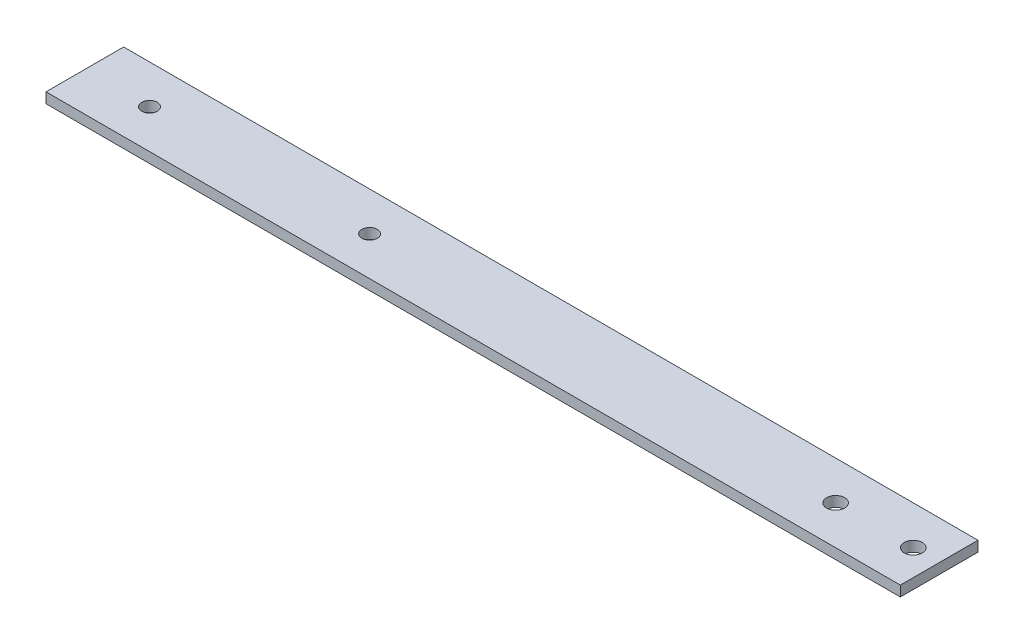
ISO-10303-21;
HEADER;
FILE_DESCRIPTION(('STEP AP214'),'2;1');
FILE_NAME('part.step','',(''),(''),'','','');
FILE_SCHEMA(('AUTOMOTIVE_DESIGN { 1 0 10303 214 1 1 1 1 }'));
ENDSEC;
DATA;
#1=APPLICATION_CONTEXT('core data for automotive mechanical design processes');
#2=APPLICATION_PROTOCOL_DEFINITION('international standard','automotive_design',2000,#1);
#3=PRODUCT_CONTEXT('',#1,'mechanical');
#4=PRODUCT('Part','Part','',(#3));
#5=PRODUCT_RELATED_PRODUCT_CATEGORY('part','',(#4));
#6=PRODUCT_DEFINITION_FORMATION('','',#4);
#7=PRODUCT_DEFINITION_CONTEXT('part definition',#1,'design');
#8=PRODUCT_DEFINITION('design','',#6,#7);
#9=PRODUCT_DEFINITION_SHAPE('','',#8);
#10=(LENGTH_UNIT() NAMED_UNIT(*) SI_UNIT(.MILLI.,.METRE.));
#11=(NAMED_UNIT(*) PLANE_ANGLE_UNIT() SI_UNIT($,.RADIAN.));
#12=(NAMED_UNIT(*) SI_UNIT($,.STERADIAN.) SOLID_ANGLE_UNIT());
#13=UNCERTAINTY_MEASURE_WITH_UNIT(LENGTH_MEASURE(1.E-05),#10,'distance_accuracy_value','');
#14=(GEOMETRIC_REPRESENTATION_CONTEXT(3) GLOBAL_UNCERTAINTY_ASSIGNED_CONTEXT((#13)) GLOBAL_UNIT_ASSIGNED_CONTEXT((#10,
#11,#12)) REPRESENTATION_CONTEXT('',''));
#15=CARTESIAN_POINT('',(0.,0.,0.));
#16=DIRECTION('',(0.,0.,1.));
#17=DIRECTION('',(1.,0.,0.));
#18=AXIS2_PLACEMENT_3D('',#15,#16,#17);
#19=CARTESIAN_POINT('',(165.,-4.,15.));
#20=DIRECTION('',(1.,0.,0.));
#21=DIRECTION('',(0.,0.,-1.));
#22=AXIS2_PLACEMENT_3D('',#19,#20,#21);
#23=PLANE('',#22);
#24=DIRECTION('',(0.,0.,-1.));
#25=VECTOR('',#24,1.);
#26=CARTESIAN_POINT('',(165.,0.,15.));
#27=LINE('',#26,#25);
#28=CARTESIAN_POINT('',(165.,0.,15.));
#29=VERTEX_POINT('',#28);
#30=CARTESIAN_POINT('',(165.,0.,-15.));
#31=VERTEX_POINT('',#30);
#32=EDGE_CURVE('E82',#29,#31,#27,.T.);
#33=ORIENTED_EDGE('',*,*,#32,.F.);
#34=DIRECTION('',(0.,1.,0.));
#35=VECTOR('',#34,1.);
#36=CARTESIAN_POINT('',(165.,-4.,15.));
#37=LINE('',#36,#35);
#38=CARTESIAN_POINT('',(165.,-4.,15.));
#39=VERTEX_POINT('',#38);
#40=EDGE_CURVE('E11',#39,#29,#37,.T.);
#41=ORIENTED_EDGE('',*,*,#40,.F.);
#42=DIRECTION('',(0.,0.,-1.));
#43=VECTOR('',#42,1.);
#44=CARTESIAN_POINT('',(165.,-4.,15.));
#45=LINE('',#44,#43);
#46=CARTESIAN_POINT('',(165.,-4.,-15.));
#47=VERTEX_POINT('',#46);
#48=EDGE_CURVE('E75',#39,#47,#45,.T.);
#49=ORIENTED_EDGE('',*,*,#48,.T.);
#50=DIRECTION('',(0.,1.,0.));
#51=VECTOR('',#50,1.);
#52=CARTESIAN_POINT('',(165.,-4.,-15.));
#53=LINE('',#52,#51);
#54=EDGE_CURVE('E20',#47,#31,#53,.T.);
#55=ORIENTED_EDGE('',*,*,#54,.T.);
#56=EDGE_LOOP('',(#33,#41,#49,#55));
#57=FACE_BOUND('',#56,.T.);
#58=ADVANCED_FACE('F17',(#57),#23,.T.);
#59=CARTESIAN_POINT('',(-165.,-4.,15.));
#60=DIRECTION('',(0.,0.,1.));
#61=DIRECTION('',(1.,0.,0.));
#62=AXIS2_PLACEMENT_3D('',#59,#60,#61);
#63=PLANE('',#62);
#64=DIRECTION('',(1.,0.,0.));
#65=VECTOR('',#64,1.);
#66=CARTESIAN_POINT('',(-165.,0.,15.));
#67=LINE('',#66,#65);
#68=CARTESIAN_POINT('',(-165.,0.,15.));
#69=VERTEX_POINT('',#68);
#70=EDGE_CURVE('E77',#69,#29,#67,.T.);
#71=ORIENTED_EDGE('',*,*,#70,.F.);
#72=DIRECTION('',(0.,1.,0.));
#73=VECTOR('',#72,1.);
#74=CARTESIAN_POINT('',(-165.,-4.,15.));
#75=LINE('',#74,#73);
#76=CARTESIAN_POINT('',(-165.,-4.,15.));
#77=VERTEX_POINT('',#76);
#78=EDGE_CURVE('E26',#77,#69,#75,.T.);
#79=ORIENTED_EDGE('',*,*,#78,.F.);
#80=DIRECTION('',(1.,0.,0.));
#81=VECTOR('',#80,1.);
#82=CARTESIAN_POINT('',(-165.,-4.,15.));
#83=LINE('',#82,#81);
#84=EDGE_CURVE('E72',#77,#39,#83,.T.);
#85=ORIENTED_EDGE('',*,*,#84,.T.);
#86=ORIENTED_EDGE('',*,*,#40,.T.);
#87=EDGE_LOOP('',(#71,#79,#85,#86));
#88=FACE_BOUND('',#87,.T.);
#89=ADVANCED_FACE('F93',(#88),#63,.T.);
#90=CARTESIAN_POINT('',(-165.,-4.,15.));
#91=DIRECTION('',(-1.,0.,0.));
#92=DIRECTION('',(0.,0.,1.));
#93=AXIS2_PLACEMENT_3D('',#90,#91,#92);
#94=PLANE('',#93);
#95=DIRECTION('',(0.,0.,1.));
#96=VECTOR('',#95,1.);
#97=CARTESIAN_POINT('',(-165.,0.,15.));
#98=LINE('',#97,#96);
#99=CARTESIAN_POINT('',(-165.,0.,-15.));
#100=VERTEX_POINT('',#99);
#101=EDGE_CURVE('E67',#100,#69,#98,.T.);
#102=ORIENTED_EDGE('',*,*,#101,.F.);
#103=DIRECTION('',(0.,1.,0.));
#104=VECTOR('',#103,1.);
#105=CARTESIAN_POINT('',(-165.,-4.,-15.));
#106=LINE('',#105,#104);
#107=CARTESIAN_POINT('',(-165.,-4.,-15.));
#108=VERTEX_POINT('',#107);
#109=EDGE_CURVE('E62',#108,#100,#106,.T.);
#110=ORIENTED_EDGE('',*,*,#109,.F.);
#111=DIRECTION('',(0.,0.,1.));
#112=VECTOR('',#111,1.);
#113=CARTESIAN_POINT('',(-165.,-4.,15.));
#114=LINE('',#113,#112);
#115=EDGE_CURVE('E65',#108,#77,#114,.T.);
#116=ORIENTED_EDGE('',*,*,#115,.T.);
#117=ORIENTED_EDGE('',*,*,#78,.T.);
#118=EDGE_LOOP('',(#102,#110,#116,#117));
#119=FACE_BOUND('',#118,.T.);
#120=ADVANCED_FACE('F64',(#119),#94,.T.);
#121=CARTESIAN_POINT('',(-165.,-4.,-15.));
#122=DIRECTION('',(0.,0.,-1.));
#123=DIRECTION('',(-1.,0.,0.));
#124=AXIS2_PLACEMENT_3D('',#121,#122,#123);
#125=PLANE('',#124);
#126=DIRECTION('',(-1.,0.,0.));
#127=VECTOR('',#126,1.);
#128=CARTESIAN_POINT('',(-165.,0.,-15.));
#129=LINE('',#128,#127);
#130=EDGE_CURVE('E85',#31,#100,#129,.T.);
#131=ORIENTED_EDGE('',*,*,#130,.F.);
#132=ORIENTED_EDGE('',*,*,#54,.F.);
#133=DIRECTION('',(-1.,0.,0.));
#134=VECTOR('',#133,1.);
#135=CARTESIAN_POINT('',(-165.,-4.,-15.));
#136=LINE('',#135,#134);
#137=EDGE_CURVE('E71',#47,#108,#136,.T.);
#138=ORIENTED_EDGE('',*,*,#137,.T.);
#139=ORIENTED_EDGE('',*,*,#109,.T.);
#140=EDGE_LOOP('',(#131,#132,#138,#139));
#141=FACE_BOUND('',#140,.T.);
#142=ADVANCED_FACE('F74',(#141),#125,.T.);
#143=CARTESIAN_POINT('',(0.,-4.,0.));
#144=DIRECTION('',(0.,-1.,0.));
#145=DIRECTION('',(0.,0.,-1.));
#146=AXIS2_PLACEMENT_3D('',#143,#144,#145);
#147=PLANE('',#146);
#148=CARTESIAN_POINT('',(-55.,-4.,0.));
#149=DIRECTION('',(0.,-1.,0.));
#150=DIRECTION('',(0.,0.,-1.));
#151=AXIS2_PLACEMENT_3D('',#148,#149,#150);
#152=CIRCLE('',#151,3.);
#153=CARTESIAN_POINT('',(-55.,-4.,-3.));
#154=VERTEX_POINT('',#153);
#155=EDGE_CURVE('E142',#154,#154,#152,.T.);
#156=ORIENTED_EDGE('',*,*,#155,.F.);
#157=EDGE_LOOP('',(#156));
#158=FACE_BOUND('',#157,.T.);
#159=CARTESIAN_POINT('',(-140.,-4.,0.));
#160=DIRECTION('',(0.,-1.,0.));
#161=DIRECTION('',(0.,0.,-1.));
#162=AXIS2_PLACEMENT_3D('',#159,#160,#161);
#163=CIRCLE('',#162,3.);
#164=CARTESIAN_POINT('',(-140.,-4.,-3.));
#165=VERTEX_POINT('',#164);
#166=EDGE_CURVE('E144',#165,#165,#163,.T.);
#167=ORIENTED_EDGE('',*,*,#166,.F.);
#168=EDGE_LOOP('',(#167));
#169=FACE_BOUND('',#168,.T.);
#170=CARTESIAN_POINT('',(155.,-4.,0.));
#171=DIRECTION('',(0.,1.,0.));
#172=DIRECTION('',(0.,0.,1.));
#173=AXIS2_PLACEMENT_3D('',#170,#171,#172);
#174=CIRCLE('',#173,3.5);
#175=CARTESIAN_POINT('',(155.,-4.,3.5));
#176=VERTEX_POINT('',#175);
#177=EDGE_CURVE('E155',#176,#176,#174,.T.);
#178=ORIENTED_EDGE('',*,*,#177,.T.);
#179=EDGE_LOOP('',(#178));
#180=FACE_BOUND('',#179,.T.);
#181=CARTESIAN_POINT('',(125.,-4.,0.));
#182=DIRECTION('',(0.,1.,0.));
#183=DIRECTION('',(0.,0.,1.));
#184=AXIS2_PLACEMENT_3D('',#181,#182,#183);
#185=CIRCLE('',#184,3.5);
#186=CARTESIAN_POINT('',(125.,-4.,3.5));
#187=VERTEX_POINT('',#186);
#188=EDGE_CURVE('E86',#187,#187,#185,.T.);
#189=ORIENTED_EDGE('',*,*,#188,.T.);
#190=EDGE_LOOP('',(#189));
#191=FACE_BOUND('',#190,.T.);
#192=ORIENTED_EDGE('',*,*,#48,.F.);
#193=ORIENTED_EDGE('',*,*,#84,.F.);
#194=ORIENTED_EDGE('',*,*,#115,.F.);
#195=ORIENTED_EDGE('',*,*,#137,.F.);
#196=EDGE_LOOP('',(#192,#193,#194,#195));
#197=FACE_BOUND('',#196,.T.);
#198=ADVANCED_FACE('F70',(#158,#169,#180,#191,#197),#147,.T.);
#199=CARTESIAN_POINT('',(0.,0.,0.));
#200=DIRECTION('',(0.,-1.,0.));
#201=DIRECTION('',(0.,0.,-1.));
#202=AXIS2_PLACEMENT_3D('',#199,#200,#201);
#203=PLANE('',#202);
#204=CARTESIAN_POINT('',(-55.,0.,0.));
#205=DIRECTION('',(0.,-1.,0.));
#206=DIRECTION('',(0.,0.,-1.));
#207=AXIS2_PLACEMENT_3D('',#204,#205,#206);
#208=CIRCLE('',#207,3.);
#209=CARTESIAN_POINT('',(-55.,0.,-3.));
#210=VERTEX_POINT('',#209);
#211=EDGE_CURVE('E140',#210,#210,#208,.T.);
#212=ORIENTED_EDGE('',*,*,#211,.T.);
#213=EDGE_LOOP('',(#212));
#214=FACE_BOUND('',#213,.T.);
#215=CARTESIAN_POINT('',(-140.,0.,0.));
#216=DIRECTION('',(0.,-1.,0.));
#217=DIRECTION('',(0.,0.,-1.));
#218=AXIS2_PLACEMENT_3D('',#215,#216,#217);
#219=CIRCLE('',#218,3.);
#220=CARTESIAN_POINT('',(-140.,0.,-3.));
#221=VERTEX_POINT('',#220);
#222=EDGE_CURVE('E149',#221,#221,#219,.T.);
#223=ORIENTED_EDGE('',*,*,#222,.T.);
#224=EDGE_LOOP('',(#223));
#225=FACE_BOUND('',#224,.T.);
#226=CARTESIAN_POINT('',(155.,0.,0.));
#227=DIRECTION('',(0.,1.,0.));
#228=DIRECTION('',(0.,0.,1.));
#229=AXIS2_PLACEMENT_3D('',#226,#227,#228);
#230=CIRCLE('',#229,3.5);
#231=CARTESIAN_POINT('',(155.,0.,3.5));
#232=VERTEX_POINT('',#231);
#233=EDGE_CURVE('E152',#232,#232,#230,.T.);
#234=ORIENTED_EDGE('',*,*,#233,.F.);
#235=EDGE_LOOP('',(#234));
#236=FACE_BOUND('',#235,.T.);
#237=CARTESIAN_POINT('',(125.,0.,0.));
#238=DIRECTION('',(0.,1.,0.));
#239=DIRECTION('',(0.,0.,1.));
#240=AXIS2_PLACEMENT_3D('',#237,#238,#239);
#241=CIRCLE('',#240,3.5);
#242=CARTESIAN_POINT('',(125.,0.,3.5));
#243=VERTEX_POINT('',#242);
#244=EDGE_CURVE('E158',#243,#243,#241,.T.);
#245=ORIENTED_EDGE('',*,*,#244,.F.);
#246=EDGE_LOOP('',(#245));
#247=FACE_BOUND('',#246,.T.);
#248=ORIENTED_EDGE('',*,*,#32,.T.);
#249=ORIENTED_EDGE('',*,*,#130,.T.);
#250=ORIENTED_EDGE('',*,*,#101,.T.);
#251=ORIENTED_EDGE('',*,*,#70,.T.);
#252=EDGE_LOOP('',(#248,#249,#250,#251));
#253=FACE_BOUND('',#252,.T.);
#254=ADVANCED_FACE('F92',(#214,#225,#236,#247,#253),#203,.F.);
#255=CARTESIAN_POINT('',(125.,0.,0.));
#256=DIRECTION('',(0.,1.,0.));
#257=DIRECTION('',(0.,0.,1.));
#258=AXIS2_PLACEMENT_3D('',#255,#256,#257);
#259=CYLINDRICAL_SURFACE('',#258,3.5);
#260=ORIENTED_EDGE('',*,*,#188,.F.);
#261=EDGE_LOOP('',(#260));
#262=FACE_BOUND('',#261,.T.);
#263=ORIENTED_EDGE('',*,*,#244,.T.);
#264=EDGE_LOOP('',(#263));
#265=FACE_BOUND('',#264,.T.);
#266=ADVANCED_FACE('F115',(#262,#265),#259,.F.);
#267=CARTESIAN_POINT('',(155.,0.,0.));
#268=DIRECTION('',(0.,1.,0.));
#269=DIRECTION('',(0.,0.,1.));
#270=AXIS2_PLACEMENT_3D('',#267,#268,#269);
#271=CYLINDRICAL_SURFACE('',#270,3.5);
#272=ORIENTED_EDGE('',*,*,#177,.F.);
#273=EDGE_LOOP('',(#272));
#274=FACE_BOUND('',#273,.T.);
#275=ORIENTED_EDGE('',*,*,#233,.T.);
#276=EDGE_LOOP('',(#275));
#277=FACE_BOUND('',#276,.T.);
#278=ADVANCED_FACE('F122',(#274,#277),#271,.F.);
#279=CARTESIAN_POINT('',(-140.,-4.,0.));
#280=DIRECTION('',(0.,-1.,0.));
#281=DIRECTION('',(0.,0.,-1.));
#282=AXIS2_PLACEMENT_3D('',#279,#280,#281);
#283=CYLINDRICAL_SURFACE('',#282,3.);
#284=ORIENTED_EDGE('',*,*,#222,.F.);
#285=EDGE_LOOP('',(#284));
#286=FACE_BOUND('',#285,.T.);
#287=ORIENTED_EDGE('',*,*,#166,.T.);
#288=EDGE_LOOP('',(#287));
#289=FACE_BOUND('',#288,.T.);
#290=ADVANCED_FACE('F126',(#286,#289),#283,.F.);
#291=CARTESIAN_POINT('',(-55.,-4.,0.));
#292=DIRECTION('',(0.,-1.,0.));
#293=DIRECTION('',(0.,0.,-1.));
#294=AXIS2_PLACEMENT_3D('',#291,#292,#293);
#295=CYLINDRICAL_SURFACE('',#294,3.);
#296=ORIENTED_EDGE('',*,*,#211,.F.);
#297=EDGE_LOOP('',(#296));
#298=FACE_BOUND('',#297,.T.);
#299=ORIENTED_EDGE('',*,*,#155,.T.);
#300=EDGE_LOOP('',(#299));
#301=FACE_BOUND('',#300,.T.);
#302=ADVANCED_FACE('F130',(#298,#301),#295,.F.);
#303=CLOSED_SHELL('',(#58,#89,#120,#142,#198,#254,#266,#278,#290,#302));
#304=MANIFOLD_SOLID_BREP('B1',#303);
#305=ADVANCED_BREP_SHAPE_REPRESENTATION('',(#18,#304),#14);
#306=SHAPE_DEFINITION_REPRESENTATION(#9,#305);
ENDSEC;
END-ISO-10303-21;
